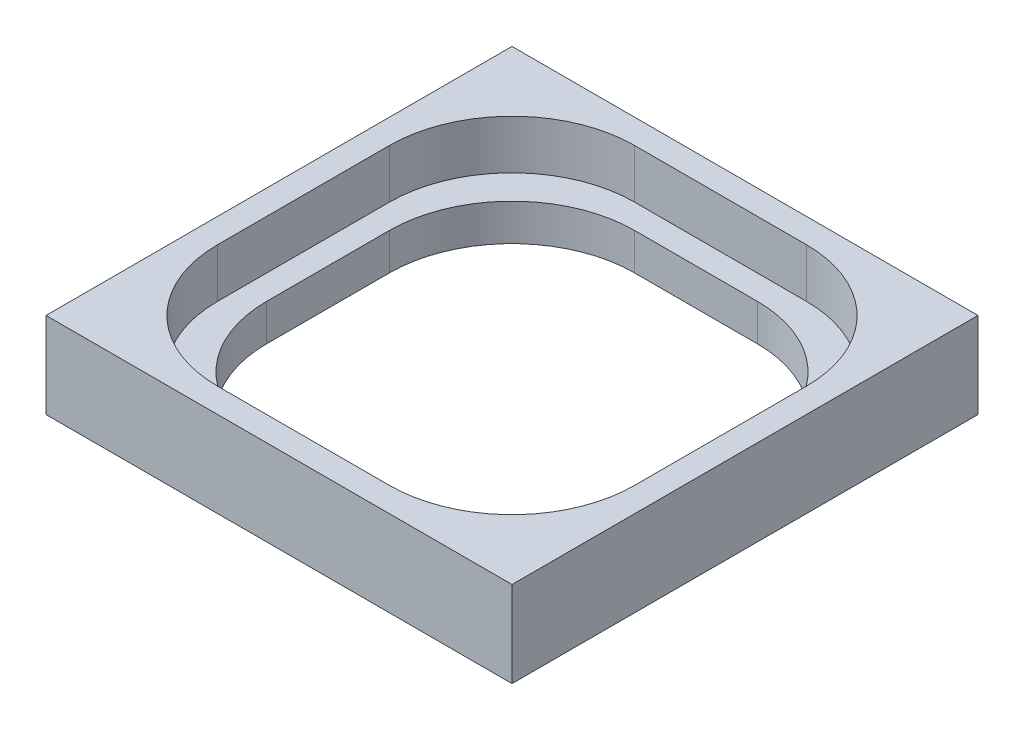
ISO-10303-21;
HEADER;
FILE_DESCRIPTION(('STEP AP214'),'2;1');
FILE_NAME('part.step','',(''),(''),'','','');
FILE_SCHEMA(('AUTOMOTIVE_DESIGN { 1 0 10303 214 1 1 1 1 }'));
ENDSEC;
DATA;
#1=APPLICATION_CONTEXT('core data for automotive mechanical design processes');
#2=APPLICATION_PROTOCOL_DEFINITION('international standard','automotive_design',2000,#1);
#3=PRODUCT_CONTEXT('',#1,'mechanical');
#4=PRODUCT('Part','Part','',(#3));
#5=PRODUCT_RELATED_PRODUCT_CATEGORY('part','',(#4));
#6=PRODUCT_DEFINITION_FORMATION('','',#4);
#7=PRODUCT_DEFINITION_CONTEXT('part definition',#1,'design');
#8=PRODUCT_DEFINITION('design','',#6,#7);
#9=PRODUCT_DEFINITION_SHAPE('','',#8);
#10=(LENGTH_UNIT() NAMED_UNIT(*) SI_UNIT(.MILLI.,.METRE.));
#11=(NAMED_UNIT(*) PLANE_ANGLE_UNIT() SI_UNIT($,.RADIAN.));
#12=(NAMED_UNIT(*) SI_UNIT($,.STERADIAN.) SOLID_ANGLE_UNIT());
#13=UNCERTAINTY_MEASURE_WITH_UNIT(LENGTH_MEASURE(1.E-05),#10,'distance_accuracy_value','');
#14=(GEOMETRIC_REPRESENTATION_CONTEXT(3) GLOBAL_UNCERTAINTY_ASSIGNED_CONTEXT((#13)) GLOBAL_UNIT_ASSIGNED_CONTEXT((#10,
#11,#12)) REPRESENTATION_CONTEXT('',''));
#15=CARTESIAN_POINT('',(0.,0.,0.));
#16=DIRECTION('',(0.,0.,1.));
#17=DIRECTION('',(1.,0.,0.));
#18=AXIS2_PLACEMENT_3D('',#15,#16,#17);
#19=CARTESIAN_POINT('',(0.,3.,0.));
#20=DIRECTION('',(0.,1.,0.));
#21=DIRECTION('',(0.,0.,1.));
#22=AXIS2_PLACEMENT_3D('',#19,#20,#21);
#23=PLANE('',#22);
#24=CARTESIAN_POINT('',(14.,3.,-14.));
#25=DIRECTION('',(0.,-1.,0.));
#26=DIRECTION('',(0.,0.,-1.));
#27=AXIS2_PLACEMENT_3D('',#24,#25,#26);
#28=CIRCLE('',#27,10.);
#29=CARTESIAN_POINT('',(14.0000000000001,3.,-4.));
#30=VERTEX_POINT('',#29);
#31=CARTESIAN_POINT('',(4.,3.,-14.0000000000001));
#32=VERTEX_POINT('',#31);
#33=EDGE_CURVE('E330',#30,#32,#28,.T.);
#34=ORIENTED_EDGE('',*,*,#33,.T.);
#35=DIRECTION('',(0.,0.,-1.));
#36=VECTOR('',#35,1.);
#37=CARTESIAN_POINT('',(4.,3.,-14.0000000000001));
#38=LINE('',#37,#36);
#39=CARTESIAN_POINT('',(4.,3.,-23.9999999999999));
#40=VERTEX_POINT('',#39);
#41=EDGE_CURVE('E334',#32,#40,#38,.T.);
#42=ORIENTED_EDGE('',*,*,#41,.T.);
#43=CARTESIAN_POINT('',(14.,3.,-24.));
#44=DIRECTION('',(0.,1.,0.));
#45=DIRECTION('',(0.,0.,1.));
#46=AXIS2_PLACEMENT_3D('',#43,#44,#45);
#47=CIRCLE('',#46,10.);
#48=CARTESIAN_POINT('',(14.0000000000001,3.,-34.));
#49=VERTEX_POINT('',#48);
#50=EDGE_CURVE('E339',#49,#40,#47,.T.);
#51=ORIENTED_EDGE('',*,*,#50,.F.);
#52=DIRECTION('',(1.,0.,0.));
#53=VECTOR('',#52,1.);
#54=CARTESIAN_POINT('',(14.0000000000001,3.,-34.));
#55=LINE('',#54,#53);
#56=CARTESIAN_POINT('',(23.9999999999999,3.,-34.));
#57=VERTEX_POINT('',#56);
#58=EDGE_CURVE('E342',#49,#57,#55,.T.);
#59=ORIENTED_EDGE('',*,*,#58,.T.);
#60=CARTESIAN_POINT('',(24.,3.,-24.));
#61=DIRECTION('',(0.,-1.,0.));
#62=DIRECTION('',(0.,0.,-1.));
#63=AXIS2_PLACEMENT_3D('',#60,#61,#62);
#64=CIRCLE('',#63,10.);
#65=CARTESIAN_POINT('',(34.,3.,-23.9999999999999));
#66=VERTEX_POINT('',#65);
#67=EDGE_CURVE('E346',#57,#66,#64,.T.);
#68=ORIENTED_EDGE('',*,*,#67,.T.);
#69=DIRECTION('',(0.,0.,-1.));
#70=VECTOR('',#69,1.);
#71=CARTESIAN_POINT('',(34.,3.,-14.0000000000001));
#72=LINE('',#71,#70);
#73=CARTESIAN_POINT('',(34.,3.,-14.0000000000001));
#74=VERTEX_POINT('',#73);
#75=EDGE_CURVE('E350',#74,#66,#72,.T.);
#76=ORIENTED_EDGE('',*,*,#75,.F.);
#77=CARTESIAN_POINT('',(24.,3.,-14.));
#78=DIRECTION('',(0.,-1.,0.));
#79=DIRECTION('',(0.,0.,-1.));
#80=AXIS2_PLACEMENT_3D('',#77,#78,#79);
#81=CIRCLE('',#80,10.);
#82=CARTESIAN_POINT('',(23.9999999999999,3.,-4.));
#83=VERTEX_POINT('',#82);
#84=EDGE_CURVE('E353',#74,#83,#81,.T.);
#85=ORIENTED_EDGE('',*,*,#84,.T.);
#86=DIRECTION('',(1.,0.,0.));
#87=VECTOR('',#86,1.);
#88=CARTESIAN_POINT('',(14.0000000000001,3.,-4.));
#89=LINE('',#88,#87);
#90=EDGE_CURVE('E357',#30,#83,#89,.T.);
#91=ORIENTED_EDGE('',*,*,#90,.F.);
#92=EDGE_LOOP('',(#34,#42,#51,#59,#68,#76,#85,#91));
#93=FACE_BOUND('',#92,.T.);
#94=DIRECTION('',(0.,0.,-1.));
#95=VECTOR('',#94,1.);
#96=CARTESIAN_POINT('',(36.,3.,-25.9999999999999));
#97=LINE('',#96,#95);
#98=CARTESIAN_POINT('',(36.,3.,-12.0000000000001));
#99=VERTEX_POINT('',#98);
#100=CARTESIAN_POINT('',(36.,3.,-25.9999999999999));
#101=VERTEX_POINT('',#100);
#102=EDGE_CURVE('E231',#99,#101,#97,.T.);
#103=ORIENTED_EDGE('',*,*,#102,.T.);
#104=CARTESIAN_POINT('',(26.,3.,-26.));
#105=DIRECTION('',(0.,1.,0.));
#106=DIRECTION('',(0.,0.,-1.));
#107=AXIS2_PLACEMENT_3D('',#104,#105,#106);
#108=CIRCLE('',#107,10.);
#109=CARTESIAN_POINT('',(25.9999999999999,3.,-36.));
#110=VERTEX_POINT('',#109);
#111=EDGE_CURVE('E267',#101,#110,#108,.T.);
#112=ORIENTED_EDGE('',*,*,#111,.T.);
#113=DIRECTION('',(-1.,0.,0.));
#114=VECTOR('',#113,1.);
#115=CARTESIAN_POINT('',(12.0000000000001,3.,-36.));
#116=LINE('',#115,#114);
#117=CARTESIAN_POINT('',(12.0000000000001,3.,-36.));
#118=VERTEX_POINT('',#117);
#119=EDGE_CURVE('E237',#110,#118,#116,.T.);
#120=ORIENTED_EDGE('',*,*,#119,.T.);
#121=CARTESIAN_POINT('',(12.,3.,-26.));
#122=DIRECTION('',(0.,1.,0.));
#123=DIRECTION('',(0.,0.,1.));
#124=AXIS2_PLACEMENT_3D('',#121,#122,#123);
#125=CIRCLE('',#124,10.);
#126=CARTESIAN_POINT('',(2.,3.,-25.9999999999999));
#127=VERTEX_POINT('',#126);
#128=EDGE_CURVE('E272',#118,#127,#125,.T.);
#129=ORIENTED_EDGE('',*,*,#128,.T.);
#130=DIRECTION('',(0.,0.,1.));
#131=VECTOR('',#130,1.);
#132=CARTESIAN_POINT('',(2.,3.,-25.9999999999999));
#133=LINE('',#132,#131);
#134=CARTESIAN_POINT('',(2.,3.,-12.0000000000001));
#135=VERTEX_POINT('',#134);
#136=EDGE_CURVE('E276',#127,#135,#133,.T.);
#137=ORIENTED_EDGE('',*,*,#136,.T.);
#138=CARTESIAN_POINT('',(12.,3.,-12.));
#139=DIRECTION('',(0.,1.,0.));
#140=DIRECTION('',(0.,0.,-1.));
#141=AXIS2_PLACEMENT_3D('',#138,#139,#140);
#142=CIRCLE('',#141,10.);
#143=CARTESIAN_POINT('',(12.0000000000001,3.,-2.));
#144=VERTEX_POINT('',#143);
#145=EDGE_CURVE('E280',#135,#144,#142,.T.);
#146=ORIENTED_EDGE('',*,*,#145,.T.);
#147=DIRECTION('',(1.,0.,0.));
#148=VECTOR('',#147,1.);
#149=CARTESIAN_POINT('',(12.0000000000001,3.,-2.));
#150=LINE('',#149,#148);
#151=CARTESIAN_POINT('',(25.9999999999999,3.,-2.));
#152=VERTEX_POINT('',#151);
#153=EDGE_CURVE('E284',#144,#152,#150,.T.);
#154=ORIENTED_EDGE('',*,*,#153,.T.);
#155=CARTESIAN_POINT('',(26.,3.,-12.));
#156=DIRECTION('',(0.,1.,0.));
#157=DIRECTION('',(0.,0.,-1.));
#158=AXIS2_PLACEMENT_3D('',#155,#156,#157);
#159=CIRCLE('',#158,10.);
#160=EDGE_CURVE('E288',#152,#99,#159,.T.);
#161=ORIENTED_EDGE('',*,*,#160,.T.);
#162=EDGE_LOOP('',(#103,#112,#120,#129,#137,#146,#154,#161));
#163=FACE_BOUND('',#162,.T.);
#164=ADVANCED_FACE('F81',(#93,#163),#23,.T.);
#165=CARTESIAN_POINT('',(0.,3.,0.));
#166=DIRECTION('',(0.,0.,-1.));
#167=DIRECTION('',(-1.,0.,0.));
#168=AXIS2_PLACEMENT_3D('',#165,#166,#167);
#169=PLANE('',#168);
#170=DIRECTION('',(1.,0.,0.));
#171=VECTOR('',#170,1.);
#172=CARTESIAN_POINT('',(0.,0.,0.));
#173=LINE('',#172,#171);
#174=CARTESIAN_POINT('',(0.,0.,0.));
#175=VERTEX_POINT('',#174);
#176=CARTESIAN_POINT('',(38.,0.,0.));
#177=VERTEX_POINT('',#176);
#178=EDGE_CURVE('E392',#175,#177,#173,.T.);
#179=ORIENTED_EDGE('',*,*,#178,.T.);
#180=DIRECTION('',(0.,-1.,0.));
#181=VECTOR('',#180,1.);
#182=CARTESIAN_POINT('',(38.,3.,0.));
#183=LINE('',#182,#181);
#184=CARTESIAN_POINT('',(38.,7.,0.));
#185=VERTEX_POINT('',#184);
#186=EDGE_CURVE('E12',#185,#177,#183,.T.);
#187=ORIENTED_EDGE('',*,*,#186,.F.);
#188=DIRECTION('',(1.,0.,0.));
#189=VECTOR('',#188,1.);
#190=CARTESIAN_POINT('',(0.,7.,0.));
#191=LINE('',#190,#189);
#192=CARTESIAN_POINT('',(0.,7.,0.));
#193=VERTEX_POINT('',#192);
#194=EDGE_CURVE('E317',#193,#185,#191,.T.);
#195=ORIENTED_EDGE('',*,*,#194,.F.);
#196=DIRECTION('',(0.,-1.,0.));
#197=VECTOR('',#196,1.);
#198=CARTESIAN_POINT('',(0.,3.,0.));
#199=LINE('',#198,#197);
#200=EDGE_CURVE('E428',#193,#175,#199,.T.);
#201=ORIENTED_EDGE('',*,*,#200,.T.);
#202=EDGE_LOOP('',(#179,#187,#195,#201));
#203=FACE_BOUND('',#202,.T.);
#204=ADVANCED_FACE('F83',(#203),#169,.F.);
#205=CARTESIAN_POINT('',(38.,3.,0.));
#206=DIRECTION('',(-1.,0.,0.));
#207=DIRECTION('',(0.,0.,1.));
#208=AXIS2_PLACEMENT_3D('',#205,#206,#207);
#209=PLANE('',#208);
#210=DIRECTION('',(0.,0.,-1.));
#211=VECTOR('',#210,1.);
#212=CARTESIAN_POINT('',(38.,0.,0.));
#213=LINE('',#212,#211);
#214=CARTESIAN_POINT('',(38.,0.,-38.));
#215=VERTEX_POINT('',#214);
#216=EDGE_CURVE('E416',#177,#215,#213,.T.);
#217=ORIENTED_EDGE('',*,*,#216,.T.);
#218=DIRECTION('',(0.,-1.,0.));
#219=VECTOR('',#218,1.);
#220=CARTESIAN_POINT('',(38.,3.,-38.));
#221=LINE('',#220,#219);
#222=CARTESIAN_POINT('',(38.,7.,-38.));
#223=VERTEX_POINT('',#222);
#224=EDGE_CURVE('E90',#223,#215,#221,.T.);
#225=ORIENTED_EDGE('',*,*,#224,.F.);
#226=DIRECTION('',(0.,0.,-1.));
#227=VECTOR('',#226,1.);
#228=CARTESIAN_POINT('',(38.,7.,-38.));
#229=LINE('',#228,#227);
#230=EDGE_CURVE('E321',#185,#223,#229,.T.);
#231=ORIENTED_EDGE('',*,*,#230,.F.);
#232=ORIENTED_EDGE('',*,*,#186,.T.);
#233=EDGE_LOOP('',(#217,#225,#231,#232));
#234=FACE_BOUND('',#233,.T.);
#235=ADVANCED_FACE('F440',(#234),#209,.F.);
#236=CARTESIAN_POINT('',(0.,3.,-38.));
#237=DIRECTION('',(0.,0.,-1.));
#238=DIRECTION('',(-1.,0.,0.));
#239=AXIS2_PLACEMENT_3D('',#236,#237,#238);
#240=PLANE('',#239);
#241=DIRECTION('',(1.,0.,0.));
#242=VECTOR('',#241,1.);
#243=CARTESIAN_POINT('',(0.,0.,-38.));
#244=LINE('',#243,#242);
#245=CARTESIAN_POINT('',(0.,0.,-38.));
#246=VERTEX_POINT('',#245);
#247=EDGE_CURVE('E420',#246,#215,#244,.T.);
#248=ORIENTED_EDGE('',*,*,#247,.F.);
#249=DIRECTION('',(0.,-1.,0.));
#250=VECTOR('',#249,1.);
#251=CARTESIAN_POINT('',(0.,3.,-38.));
#252=LINE('',#251,#250);
#253=CARTESIAN_POINT('',(0.,7.,-38.));
#254=VERTEX_POINT('',#253);
#255=EDGE_CURVE('E431',#254,#246,#252,.T.);
#256=ORIENTED_EDGE('',*,*,#255,.F.);
#257=DIRECTION('',(-1.,0.,0.));
#258=VECTOR('',#257,1.);
#259=CARTESIAN_POINT('',(0.,7.,-38.));
#260=LINE('',#259,#258);
#261=EDGE_CURVE('E325',#223,#254,#260,.T.);
#262=ORIENTED_EDGE('',*,*,#261,.F.);
#263=ORIENTED_EDGE('',*,*,#224,.T.);
#264=EDGE_LOOP('',(#248,#256,#262,#263));
#265=FACE_BOUND('',#264,.T.);
#266=ADVANCED_FACE('F437',(#265),#240,.T.);
#267=CARTESIAN_POINT('',(0.,3.,0.));
#268=DIRECTION('',(-1.,0.,0.));
#269=DIRECTION('',(0.,0.,1.));
#270=AXIS2_PLACEMENT_3D('',#267,#268,#269);
#271=PLANE('',#270);
#272=DIRECTION('',(0.,0.,-1.));
#273=VECTOR('',#272,1.);
#274=CARTESIAN_POINT('',(0.,0.,0.));
#275=LINE('',#274,#273);
#276=EDGE_CURVE('E424',#175,#246,#275,.T.);
#277=ORIENTED_EDGE('',*,*,#276,.F.);
#278=ORIENTED_EDGE('',*,*,#200,.F.);
#279=DIRECTION('',(0.,0.,1.));
#280=VECTOR('',#279,1.);
#281=CARTESIAN_POINT('',(0.,7.,-38.));
#282=LINE('',#281,#280);
#283=EDGE_CURVE('E239',#254,#193,#282,.T.);
#284=ORIENTED_EDGE('',*,*,#283,.F.);
#285=ORIENTED_EDGE('',*,*,#255,.T.);
#286=EDGE_LOOP('',(#277,#278,#284,#285));
#287=FACE_BOUND('',#286,.T.);
#288=ADVANCED_FACE('F446',(#287),#271,.T.);
#289=CARTESIAN_POINT('',(0.,0.,0.));
#290=DIRECTION('',(0.,1.,0.));
#291=DIRECTION('',(0.,0.,1.));
#292=AXIS2_PLACEMENT_3D('',#289,#290,#291);
#293=PLANE('',#292);
#294=DIRECTION('',(0.,0.,-1.));
#295=VECTOR('',#294,1.);
#296=CARTESIAN_POINT('',(4.,0.,-14.0000000000001));
#297=LINE('',#296,#295);
#298=CARTESIAN_POINT('',(4.,0.,-14.0000000000001));
#299=VERTEX_POINT('',#298);
#300=CARTESIAN_POINT('',(4.,0.,-23.9999999999999));
#301=VERTEX_POINT('',#300);
#302=EDGE_CURVE('E363',#299,#301,#297,.T.);
#303=ORIENTED_EDGE('',*,*,#302,.F.);
#304=CARTESIAN_POINT('',(14.,0.,-14.));
#305=DIRECTION('',(0.,-1.,0.));
#306=DIRECTION('',(0.,0.,-1.));
#307=AXIS2_PLACEMENT_3D('',#304,#305,#306);
#308=CIRCLE('',#307,10.);
#309=CARTESIAN_POINT('',(14.0000000000001,0.,-4.));
#310=VERTEX_POINT('',#309);
#311=EDGE_CURVE('E329',#310,#299,#308,.T.);
#312=ORIENTED_EDGE('',*,*,#311,.F.);
#313=DIRECTION('',(1.,0.,0.));
#314=VECTOR('',#313,1.);
#315=CARTESIAN_POINT('',(14.0000000000001,0.,-4.));
#316=LINE('',#315,#314);
#317=CARTESIAN_POINT('',(23.9999999999999,0.,-4.));
#318=VERTEX_POINT('',#317);
#319=EDGE_CURVE('E335',#310,#318,#316,.T.);
#320=ORIENTED_EDGE('',*,*,#319,.T.);
#321=CARTESIAN_POINT('',(24.,0.,-14.));
#322=DIRECTION('',(0.,-1.,0.));
#323=DIRECTION('',(0.,0.,-1.));
#324=AXIS2_PLACEMENT_3D('',#321,#322,#323);
#325=CIRCLE('',#324,10.);
#326=CARTESIAN_POINT('',(34.,0.,-14.0000000000001));
#327=VERTEX_POINT('',#326);
#328=EDGE_CURVE('E382',#327,#318,#325,.T.);
#329=ORIENTED_EDGE('',*,*,#328,.F.);
#330=DIRECTION('',(0.,0.,-1.));
#331=VECTOR('',#330,1.);
#332=CARTESIAN_POINT('',(34.,0.,-14.0000000000001));
#333=LINE('',#332,#331);
#334=CARTESIAN_POINT('',(34.,0.,-23.9999999999999));
#335=VERTEX_POINT('',#334);
#336=EDGE_CURVE('E378',#327,#335,#333,.T.);
#337=ORIENTED_EDGE('',*,*,#336,.T.);
#338=CARTESIAN_POINT('',(24.,0.,-24.));
#339=DIRECTION('',(0.,-1.,0.));
#340=DIRECTION('',(0.,0.,-1.));
#341=AXIS2_PLACEMENT_3D('',#338,#339,#340);
#342=CIRCLE('',#341,10.);
#343=CARTESIAN_POINT('',(23.9999999999999,0.,-34.));
#344=VERTEX_POINT('',#343);
#345=EDGE_CURVE('E374',#344,#335,#342,.T.);
#346=ORIENTED_EDGE('',*,*,#345,.F.);
#347=DIRECTION('',(1.,0.,0.));
#348=VECTOR('',#347,1.);
#349=CARTESIAN_POINT('',(14.0000000000001,0.,-34.));
#350=LINE('',#349,#348);
#351=CARTESIAN_POINT('',(14.0000000000001,0.,-34.));
#352=VERTEX_POINT('',#351);
#353=EDGE_CURVE('E370',#352,#344,#350,.T.);
#354=ORIENTED_EDGE('',*,*,#353,.F.);
#355=CARTESIAN_POINT('',(14.,0.,-24.));
#356=DIRECTION('',(0.,1.,0.));
#357=DIRECTION('',(0.,0.,1.));
#358=AXIS2_PLACEMENT_3D('',#355,#356,#357);
#359=CIRCLE('',#358,10.);
#360=EDGE_CURVE('E366',#352,#301,#359,.T.);
#361=ORIENTED_EDGE('',*,*,#360,.T.);
#362=EDGE_LOOP('',(#303,#312,#320,#329,#337,#346,#354,#361));
#363=FACE_BOUND('',#362,.T.);
#364=ORIENTED_EDGE('',*,*,#178,.F.);
#365=ORIENTED_EDGE('',*,*,#276,.T.);
#366=ORIENTED_EDGE('',*,*,#247,.T.);
#367=ORIENTED_EDGE('',*,*,#216,.F.);
#368=EDGE_LOOP('',(#364,#365,#366,#367));
#369=FACE_BOUND('',#368,.T.);
#370=ADVANCED_FACE('F443',(#363,#369),#293,.F.);
#371=CARTESIAN_POINT('',(14.,3.,-14.));
#372=DIRECTION('',(0.,-1.,0.));
#373=DIRECTION('',(0.,0.,-1.));
#374=AXIS2_PLACEMENT_3D('',#371,#372,#373);
#375=CYLINDRICAL_SURFACE('',#374,10.);
#376=ORIENTED_EDGE('',*,*,#311,.T.);
#377=DIRECTION('',(0.,-1.,0.));
#378=VECTOR('',#377,1.);
#379=CARTESIAN_POINT('',(4.,3.,-14.0000000000001));
#380=LINE('',#379,#378);
#381=EDGE_CURVE('E360',#32,#299,#380,.T.);
#382=ORIENTED_EDGE('',*,*,#381,.F.);
#383=ORIENTED_EDGE('',*,*,#33,.F.);
#384=DIRECTION('',(0.,-1.,0.));
#385=VECTOR('',#384,1.);
#386=CARTESIAN_POINT('',(14.0000000000001,3.,-4.));
#387=LINE('',#386,#385);
#388=EDGE_CURVE('E389',#30,#310,#387,.T.);
#389=ORIENTED_EDGE('',*,*,#388,.T.);
#390=EDGE_LOOP('',(#376,#382,#383,#389));
#391=FACE_BOUND('',#390,.T.);
#392=ADVANCED_FACE('F464',(#391),#375,.F.);
#393=CARTESIAN_POINT('',(14.0000000000001,3.,-4.));
#394=DIRECTION('',(0.,0.,-1.));
#395=DIRECTION('',(-1.,0.,0.));
#396=AXIS2_PLACEMENT_3D('',#393,#394,#395);
#397=PLANE('',#396);
#398=ORIENTED_EDGE('',*,*,#319,.F.);
#399=ORIENTED_EDGE('',*,*,#388,.F.);
#400=ORIENTED_EDGE('',*,*,#90,.T.);
#401=DIRECTION('',(0.,-1.,0.));
#402=VECTOR('',#401,1.);
#403=CARTESIAN_POINT('',(23.9999999999999,3.,-4.));
#404=LINE('',#403,#402);
#405=EDGE_CURVE('E393',#83,#318,#404,.T.);
#406=ORIENTED_EDGE('',*,*,#405,.T.);
#407=EDGE_LOOP('',(#398,#399,#400,#406));
#408=FACE_BOUND('',#407,.T.);
#409=ADVANCED_FACE('F619',(#408),#397,.T.);
#410=CARTESIAN_POINT('',(24.,3.,-14.));
#411=DIRECTION('',(0.,-1.,0.));
#412=DIRECTION('',(0.,0.,-1.));
#413=AXIS2_PLACEMENT_3D('',#410,#411,#412);
#414=CYLINDRICAL_SURFACE('',#413,10.);
#415=ORIENTED_EDGE('',*,*,#328,.T.);
#416=ORIENTED_EDGE('',*,*,#405,.F.);
#417=ORIENTED_EDGE('',*,*,#84,.F.);
#418=DIRECTION('',(0.,-1.,0.));
#419=VECTOR('',#418,1.);
#420=CARTESIAN_POINT('',(34.,3.,-14.0000000000001));
#421=LINE('',#420,#419);
#422=EDGE_CURVE('E396',#74,#327,#421,.T.);
#423=ORIENTED_EDGE('',*,*,#422,.T.);
#424=EDGE_LOOP('',(#415,#416,#417,#423));
#425=FACE_BOUND('',#424,.T.);
#426=ADVANCED_FACE('F610',(#425),#414,.F.);
#427=CARTESIAN_POINT('',(34.,3.,-14.0000000000001));
#428=DIRECTION('',(-1.,0.,0.));
#429=DIRECTION('',(0.,0.,1.));
#430=AXIS2_PLACEMENT_3D('',#427,#428,#429);
#431=PLANE('',#430);
#432=ORIENTED_EDGE('',*,*,#336,.F.);
#433=ORIENTED_EDGE('',*,*,#422,.F.);
#434=ORIENTED_EDGE('',*,*,#75,.T.);
#435=DIRECTION('',(0.,-1.,0.));
#436=VECTOR('',#435,1.);
#437=CARTESIAN_POINT('',(34.,3.,-23.9999999999999));
#438=LINE('',#437,#436);
#439=EDGE_CURVE('E399',#66,#335,#438,.T.);
#440=ORIENTED_EDGE('',*,*,#439,.T.);
#441=EDGE_LOOP('',(#432,#433,#434,#440));
#442=FACE_BOUND('',#441,.T.);
#443=ADVANCED_FACE('F601',(#442),#431,.T.);
#444=CARTESIAN_POINT('',(24.,3.,-24.));
#445=DIRECTION('',(0.,-1.,0.));
#446=DIRECTION('',(0.,0.,-1.));
#447=AXIS2_PLACEMENT_3D('',#444,#445,#446);
#448=CYLINDRICAL_SURFACE('',#447,10.);
#449=ORIENTED_EDGE('',*,*,#345,.T.);
#450=ORIENTED_EDGE('',*,*,#439,.F.);
#451=ORIENTED_EDGE('',*,*,#67,.F.);
#452=DIRECTION('',(0.,-1.,0.));
#453=VECTOR('',#452,1.);
#454=CARTESIAN_POINT('',(23.9999999999999,3.,-34.));
#455=LINE('',#454,#453);
#456=EDGE_CURVE('E402',#57,#344,#455,.T.);
#457=ORIENTED_EDGE('',*,*,#456,.T.);
#458=EDGE_LOOP('',(#449,#450,#451,#457));
#459=FACE_BOUND('',#458,.T.);
#460=ADVANCED_FACE('F592',(#459),#448,.F.);
#461=CARTESIAN_POINT('',(14.0000000000001,3.,-34.));
#462=DIRECTION('',(0.,0.,-1.));
#463=DIRECTION('',(-1.,0.,0.));
#464=AXIS2_PLACEMENT_3D('',#461,#462,#463);
#465=PLANE('',#464);
#466=ORIENTED_EDGE('',*,*,#353,.T.);
#467=ORIENTED_EDGE('',*,*,#456,.F.);
#468=ORIENTED_EDGE('',*,*,#58,.F.);
#469=DIRECTION('',(0.,-1.,0.));
#470=VECTOR('',#469,1.);
#471=CARTESIAN_POINT('',(14.0000000000001,3.,-34.));
#472=LINE('',#471,#470);
#473=EDGE_CURVE('E405',#49,#352,#472,.T.);
#474=ORIENTED_EDGE('',*,*,#473,.T.);
#475=EDGE_LOOP('',(#466,#467,#468,#474));
#476=FACE_BOUND('',#475,.T.);
#477=ADVANCED_FACE('F583',(#476),#465,.F.);
#478=CARTESIAN_POINT('',(14.,3.,-24.));
#479=DIRECTION('',(0.,-1.,0.));
#480=DIRECTION('',(0.,0.,-1.));
#481=AXIS2_PLACEMENT_3D('',#478,#479,#480);
#482=CYLINDRICAL_SURFACE('',#481,10.);
#483=ORIENTED_EDGE('',*,*,#360,.F.);
#484=ORIENTED_EDGE('',*,*,#473,.F.);
#485=ORIENTED_EDGE('',*,*,#50,.T.);
#486=DIRECTION('',(0.,-1.,0.));
#487=VECTOR('',#486,1.);
#488=CARTESIAN_POINT('',(4.,3.,-23.9999999999999));
#489=LINE('',#488,#487);
#490=EDGE_CURVE('E105',#40,#301,#489,.T.);
#491=ORIENTED_EDGE('',*,*,#490,.T.);
#492=EDGE_LOOP('',(#483,#484,#485,#491));
#493=FACE_BOUND('',#492,.T.);
#494=ADVANCED_FACE('F576',(#493),#482,.F.);
#495=CARTESIAN_POINT('',(4.,3.,-14.0000000000001));
#496=DIRECTION('',(-1.,0.,0.));
#497=DIRECTION('',(0.,0.,1.));
#498=AXIS2_PLACEMENT_3D('',#495,#496,#497);
#499=PLANE('',#498);
#500=ORIENTED_EDGE('',*,*,#302,.T.);
#501=ORIENTED_EDGE('',*,*,#490,.F.);
#502=ORIENTED_EDGE('',*,*,#41,.F.);
#503=ORIENTED_EDGE('',*,*,#381,.T.);
#504=EDGE_LOOP('',(#500,#501,#502,#503));
#505=FACE_BOUND('',#504,.T.);
#506=ADVANCED_FACE('F488',(#505),#499,.F.);
#507=CARTESIAN_POINT('',(0.,7.,0.));
#508=DIRECTION('',(0.,1.,0.));
#509=DIRECTION('',(0.,0.,1.));
#510=AXIS2_PLACEMENT_3D('',#507,#508,#509);
#511=PLANE('',#510);
#512=ORIENTED_EDGE('',*,*,#283,.T.);
#513=ORIENTED_EDGE('',*,*,#194,.T.);
#514=ORIENTED_EDGE('',*,*,#230,.T.);
#515=ORIENTED_EDGE('',*,*,#261,.T.);
#516=EDGE_LOOP('',(#512,#513,#514,#515));
#517=FACE_BOUND('',#516,.T.);
#518=DIRECTION('',(-1.,0.,0.));
#519=VECTOR('',#518,1.);
#520=CARTESIAN_POINT('',(12.0000000000001,7.,-36.));
#521=LINE('',#520,#519);
#522=CARTESIAN_POINT('',(25.9999999999999,7.,-36.));
#523=VERTEX_POINT('',#522);
#524=CARTESIAN_POINT('',(12.0000000000001,7.,-36.));
#525=VERTEX_POINT('',#524);
#526=EDGE_CURVE('E230',#523,#525,#521,.T.);
#527=ORIENTED_EDGE('',*,*,#526,.F.);
#528=CARTESIAN_POINT('',(26.,7.,-26.));
#529=DIRECTION('',(0.,1.,0.));
#530=DIRECTION('',(0.,0.,-1.));
#531=AXIS2_PLACEMENT_3D('',#528,#529,#530);
#532=CIRCLE('',#531,10.);
#533=CARTESIAN_POINT('',(36.,7.,-25.9999999999999));
#534=VERTEX_POINT('',#533);
#535=EDGE_CURVE('E221',#534,#523,#532,.T.);
#536=ORIENTED_EDGE('',*,*,#535,.F.);
#537=DIRECTION('',(0.,0.,-1.));
#538=VECTOR('',#537,1.);
#539=CARTESIAN_POINT('',(36.,7.,-25.9999999999999));
#540=LINE('',#539,#538);
#541=CARTESIAN_POINT('',(36.,7.,-12.0000000000001));
#542=VERTEX_POINT('',#541);
#543=EDGE_CURVE('E264',#542,#534,#540,.T.);
#544=ORIENTED_EDGE('',*,*,#543,.F.);
#545=CARTESIAN_POINT('',(26.,7.,-12.));
#546=DIRECTION('',(0.,1.,0.));
#547=DIRECTION('',(0.,0.,-1.));
#548=AXIS2_PLACEMENT_3D('',#545,#546,#547);
#549=CIRCLE('',#548,10.);
#550=CARTESIAN_POINT('',(25.9999999999999,7.,-2.));
#551=VERTEX_POINT('',#550);
#552=EDGE_CURVE('E260',#551,#542,#549,.T.);
#553=ORIENTED_EDGE('',*,*,#552,.F.);
#554=DIRECTION('',(1.,0.,0.));
#555=VECTOR('',#554,1.);
#556=CARTESIAN_POINT('',(12.0000000000001,7.,-2.));
#557=LINE('',#556,#555);
#558=CARTESIAN_POINT('',(12.0000000000001,7.,-2.));
#559=VERTEX_POINT('',#558);
#560=EDGE_CURVE('E257',#559,#551,#557,.T.);
#561=ORIENTED_EDGE('',*,*,#560,.F.);
#562=CARTESIAN_POINT('',(12.,7.,-12.));
#563=DIRECTION('',(0.,1.,0.));
#564=DIRECTION('',(0.,0.,-1.));
#565=AXIS2_PLACEMENT_3D('',#562,#563,#564);
#566=CIRCLE('',#565,10.);
#567=CARTESIAN_POINT('',(2.,7.,-12.0000000000001));
#568=VERTEX_POINT('',#567);
#569=EDGE_CURVE('E254',#568,#559,#566,.T.);
#570=ORIENTED_EDGE('',*,*,#569,.F.);
#571=DIRECTION('',(0.,0.,1.));
#572=VECTOR('',#571,1.);
#573=CARTESIAN_POINT('',(2.,7.,-25.9999999999999));
#574=LINE('',#573,#572);
#575=CARTESIAN_POINT('',(2.,7.,-25.9999999999999));
#576=VERTEX_POINT('',#575);
#577=EDGE_CURVE('E249',#576,#568,#574,.T.);
#578=ORIENTED_EDGE('',*,*,#577,.F.);
#579=CARTESIAN_POINT('',(12.,7.,-26.));
#580=DIRECTION('',(0.,1.,0.));
#581=DIRECTION('',(0.,0.,1.));
#582=AXIS2_PLACEMENT_3D('',#579,#580,#581);
#583=CIRCLE('',#582,10.);
#584=EDGE_CURVE('E245',#525,#576,#583,.T.);
#585=ORIENTED_EDGE('',*,*,#584,.F.);
#586=EDGE_LOOP('',(#527,#536,#544,#553,#561,#570,#578,#585));
#587=FACE_BOUND('',#586,.T.);
#588=ADVANCED_FACE('F243',(#517,#587),#511,.T.);
#589=CARTESIAN_POINT('',(26.,7.,-26.));
#590=DIRECTION('',(0.,-1.,0.));
#591=DIRECTION('',(0.,0.,-1.));
#592=AXIS2_PLACEMENT_3D('',#589,#590,#591);
#593=CYLINDRICAL_SURFACE('',#592,10.);
#594=ORIENTED_EDGE('',*,*,#111,.F.);
#595=DIRECTION('',(0.,-1.,0.));
#596=VECTOR('',#595,1.);
#597=CARTESIAN_POINT('',(36.,7.,-25.9999999999999));
#598=LINE('',#597,#596);
#599=EDGE_CURVE('E97',#534,#101,#598,.T.);
#600=ORIENTED_EDGE('',*,*,#599,.F.);
#601=ORIENTED_EDGE('',*,*,#535,.T.);
#602=DIRECTION('',(0.,-1.,0.));
#603=VECTOR('',#602,1.);
#604=CARTESIAN_POINT('',(25.9999999999999,7.,-36.));
#605=LINE('',#604,#603);
#606=EDGE_CURVE('E224',#523,#110,#605,.T.);
#607=ORIENTED_EDGE('',*,*,#606,.T.);
#608=EDGE_LOOP('',(#594,#600,#601,#607));
#609=FACE_BOUND('',#608,.T.);
#610=ADVANCED_FACE('F223',(#609),#593,.F.);
#611=CARTESIAN_POINT('',(12.0000000000001,7.,-36.));
#612=DIRECTION('',(0.,0.,1.));
#613=DIRECTION('',(1.,0.,0.));
#614=AXIS2_PLACEMENT_3D('',#611,#612,#613);
#615=PLANE('',#614);
#616=ORIENTED_EDGE('',*,*,#119,.F.);
#617=ORIENTED_EDGE('',*,*,#606,.F.);
#618=ORIENTED_EDGE('',*,*,#526,.T.);
#619=DIRECTION('',(0.,-1.,0.));
#620=VECTOR('',#619,1.);
#621=CARTESIAN_POINT('',(12.0000000000001,7.,-36.));
#622=LINE('',#621,#620);
#623=EDGE_CURVE('E240',#525,#118,#622,.T.);
#624=ORIENTED_EDGE('',*,*,#623,.T.);
#625=EDGE_LOOP('',(#616,#617,#618,#624));
#626=FACE_BOUND('',#625,.T.);
#627=ADVANCED_FACE('F234',(#626),#615,.T.);
#628=CARTESIAN_POINT('',(12.,7.,-26.));
#629=DIRECTION('',(0.,-1.,0.));
#630=DIRECTION('',(0.,0.,-1.));
#631=AXIS2_PLACEMENT_3D('',#628,#629,#630);
#632=CYLINDRICAL_SURFACE('',#631,10.);
#633=ORIENTED_EDGE('',*,*,#128,.F.);
#634=ORIENTED_EDGE('',*,*,#623,.F.);
#635=ORIENTED_EDGE('',*,*,#584,.T.);
#636=DIRECTION('',(0.,-1.,0.));
#637=VECTOR('',#636,1.);
#638=CARTESIAN_POINT('',(2.,7.,-25.9999999999999));
#639=LINE('',#638,#637);
#640=EDGE_CURVE('E309',#576,#127,#639,.T.);
#641=ORIENTED_EDGE('',*,*,#640,.T.);
#642=EDGE_LOOP('',(#633,#634,#635,#641));
#643=FACE_BOUND('',#642,.T.);
#644=ADVANCED_FACE('F503',(#643),#632,.F.);
#645=CARTESIAN_POINT('',(2.,7.,-25.9999999999999));
#646=DIRECTION('',(1.,0.,0.));
#647=DIRECTION('',(0.,0.,-1.));
#648=AXIS2_PLACEMENT_3D('',#645,#646,#647);
#649=PLANE('',#648);
#650=ORIENTED_EDGE('',*,*,#136,.F.);
#651=ORIENTED_EDGE('',*,*,#640,.F.);
#652=ORIENTED_EDGE('',*,*,#577,.T.);
#653=DIRECTION('',(0.,-1.,0.));
#654=VECTOR('',#653,1.);
#655=CARTESIAN_POINT('',(2.,7.,-12.0000000000001));
#656=LINE('',#655,#654);
#657=EDGE_CURVE('E306',#568,#135,#656,.T.);
#658=ORIENTED_EDGE('',*,*,#657,.T.);
#659=EDGE_LOOP('',(#650,#651,#652,#658));
#660=FACE_BOUND('',#659,.T.);
#661=ADVANCED_FACE('F511',(#660),#649,.T.);
#662=CARTESIAN_POINT('',(12.,7.,-12.));
#663=DIRECTION('',(0.,-1.,0.));
#664=DIRECTION('',(0.,0.,-1.));
#665=AXIS2_PLACEMENT_3D('',#662,#663,#664);
#666=CYLINDRICAL_SURFACE('',#665,10.);
#667=ORIENTED_EDGE('',*,*,#145,.F.);
#668=ORIENTED_EDGE('',*,*,#657,.F.);
#669=ORIENTED_EDGE('',*,*,#569,.T.);
#670=DIRECTION('',(0.,-1.,0.));
#671=VECTOR('',#670,1.);
#672=CARTESIAN_POINT('',(12.0000000000001,7.,-2.));
#673=LINE('',#672,#671);
#674=EDGE_CURVE('E303',#559,#144,#673,.T.);
#675=ORIENTED_EDGE('',*,*,#674,.T.);
#676=EDGE_LOOP('',(#667,#668,#669,#675));
#677=FACE_BOUND('',#676,.T.);
#678=ADVANCED_FACE('F520',(#677),#666,.F.);
#679=CARTESIAN_POINT('',(12.0000000000001,7.,-2.));
#680=DIRECTION('',(0.,0.,-1.));
#681=DIRECTION('',(-1.,0.,0.));
#682=AXIS2_PLACEMENT_3D('',#679,#680,#681);
#683=PLANE('',#682);
#684=ORIENTED_EDGE('',*,*,#153,.F.);
#685=ORIENTED_EDGE('',*,*,#674,.F.);
#686=ORIENTED_EDGE('',*,*,#560,.T.);
#687=DIRECTION('',(0.,-1.,0.));
#688=VECTOR('',#687,1.);
#689=CARTESIAN_POINT('',(25.9999999999999,7.,-2.));
#690=LINE('',#689,#688);
#691=EDGE_CURVE('E300',#551,#152,#690,.T.);
#692=ORIENTED_EDGE('',*,*,#691,.T.);
#693=EDGE_LOOP('',(#684,#685,#686,#692));
#694=FACE_BOUND('',#693,.T.);
#695=ADVANCED_FACE('F529',(#694),#683,.T.);
#696=CARTESIAN_POINT('',(26.,7.,-12.));
#697=DIRECTION('',(0.,-1.,0.));
#698=DIRECTION('',(0.,0.,-1.));
#699=AXIS2_PLACEMENT_3D('',#696,#697,#698);
#700=CYLINDRICAL_SURFACE('',#699,10.);
#701=ORIENTED_EDGE('',*,*,#160,.F.);
#702=ORIENTED_EDGE('',*,*,#691,.F.);
#703=ORIENTED_EDGE('',*,*,#552,.T.);
#704=DIRECTION('',(0.,-1.,0.));
#705=VECTOR('',#704,1.);
#706=CARTESIAN_POINT('',(36.,7.,-12.0000000000001));
#707=LINE('',#706,#705);
#708=EDGE_CURVE('E297',#542,#99,#707,.T.);
#709=ORIENTED_EDGE('',*,*,#708,.T.);
#710=EDGE_LOOP('',(#701,#702,#703,#709));
#711=FACE_BOUND('',#710,.T.);
#712=ADVANCED_FACE('F538',(#711),#700,.F.);
#713=CARTESIAN_POINT('',(36.,7.,-25.9999999999999));
#714=DIRECTION('',(-1.,0.,0.));
#715=DIRECTION('',(0.,0.,1.));
#716=AXIS2_PLACEMENT_3D('',#713,#714,#715);
#717=PLANE('',#716);
#718=ORIENTED_EDGE('',*,*,#102,.F.);
#719=ORIENTED_EDGE('',*,*,#708,.F.);
#720=ORIENTED_EDGE('',*,*,#543,.T.);
#721=ORIENTED_EDGE('',*,*,#599,.T.);
#722=EDGE_LOOP('',(#718,#719,#720,#721));
#723=FACE_BOUND('',#722,.T.);
#724=ADVANCED_FACE('F547',(#723),#717,.T.);
#725=CLOSED_SHELL('',(#164,#204,#235,#266,#288,#370,#392,#409,#426,#443,#460,#477,#494,#506,
#588,#610,#627,#644,#661,#678,#695,#712,#724));
#726=MANIFOLD_SOLID_BREP('B2',#725);
#727=ADVANCED_BREP_SHAPE_REPRESENTATION('',(#18,#726),#14);
#728=SHAPE_DEFINITION_REPRESENTATION(#9,#727);
ENDSEC;
END-ISO-10303-21;
